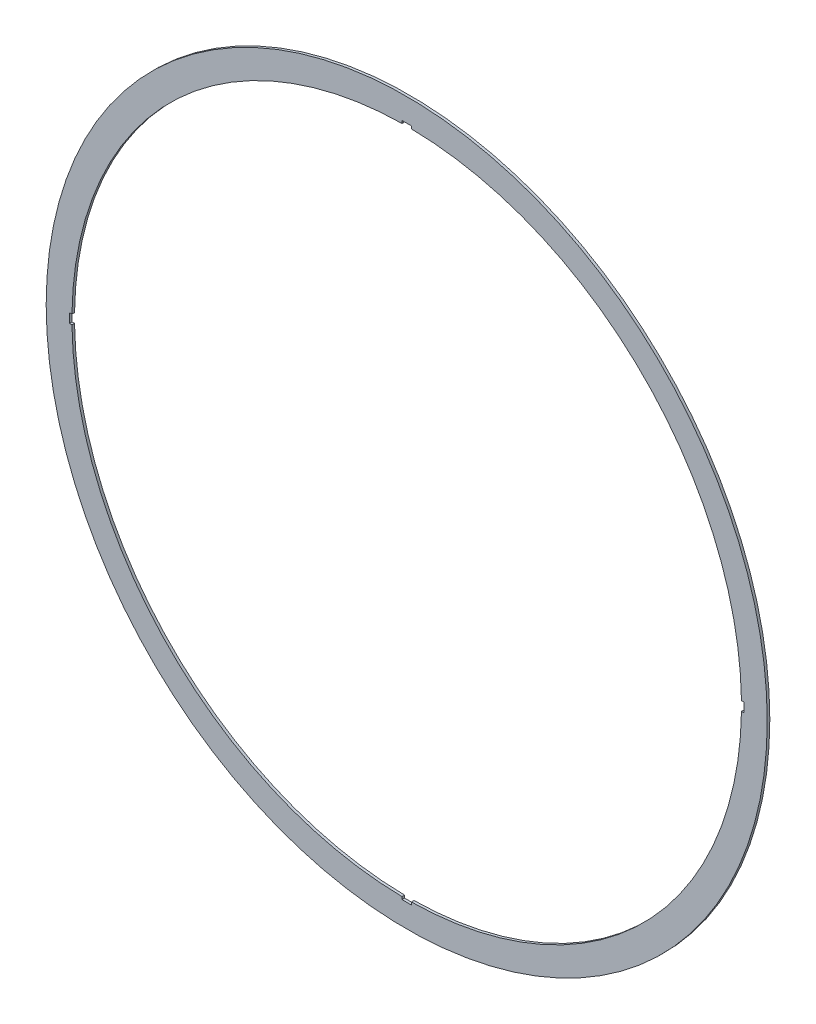
ISO-10303-21;
HEADER;
FILE_DESCRIPTION(('STEP AP214'),'2;1');
FILE_NAME('part.step','',(''),(''),'','','');
FILE_SCHEMA(('AUTOMOTIVE_DESIGN { 1 0 10303 214 1 1 1 1 }'));
ENDSEC;
DATA;
#1=APPLICATION_CONTEXT('core data for automotive mechanical design processes');
#2=APPLICATION_PROTOCOL_DEFINITION('international standard','automotive_design',2000,#1);
#3=PRODUCT_CONTEXT('',#1,'mechanical');
#4=PRODUCT('Part','Part','',(#3));
#5=PRODUCT_RELATED_PRODUCT_CATEGORY('part','',(#4));
#6=PRODUCT_DEFINITION_FORMATION('','',#4);
#7=PRODUCT_DEFINITION_CONTEXT('part definition',#1,'design');
#8=PRODUCT_DEFINITION('design','',#6,#7);
#9=PRODUCT_DEFINITION_SHAPE('','',#8);
#10=(LENGTH_UNIT() NAMED_UNIT(*) SI_UNIT(.MILLI.,.METRE.));
#11=(NAMED_UNIT(*) PLANE_ANGLE_UNIT() SI_UNIT($,.RADIAN.));
#12=(NAMED_UNIT(*) SI_UNIT($,.STERADIAN.) SOLID_ANGLE_UNIT());
#13=UNCERTAINTY_MEASURE_WITH_UNIT(LENGTH_MEASURE(1.E-05),#10,'distance_accuracy_value','');
#14=(GEOMETRIC_REPRESENTATION_CONTEXT(3) GLOBAL_UNCERTAINTY_ASSIGNED_CONTEXT((#13)) GLOBAL_UNIT_ASSIGNED_CONTEXT((#10,
#11,#12)) REPRESENTATION_CONTEXT('',''));
#15=CARTESIAN_POINT('',(0.,0.,0.));
#16=DIRECTION('',(0.,0.,1.));
#17=DIRECTION('',(1.,0.,0.));
#18=AXIS2_PLACEMENT_3D('',#15,#16,#17);
#19=CARTESIAN_POINT('',(0.,0.,3.));
#20=DIRECTION('',(0.,0.,1.));
#21=DIRECTION('',(1.,0.,0.));
#22=AXIS2_PLACEMENT_3D('',#19,#20,#21);
#23=PLANE('',#22);
#24=CARTESIAN_POINT('',(0.,0.,3.));
#25=DIRECTION('',(0.,0.,1.));
#26=DIRECTION('',(1.,0.,0.));
#27=AXIS2_PLACEMENT_3D('',#24,#25,#26);
#28=CIRCLE('',#27,420.);
#29=CARTESIAN_POINT('',(420.,0.,3.));
#30=VERTEX_POINT('',#29);
#31=EDGE_CURVE('E11',#30,#30,#28,.T.);
#32=ORIENTED_EDGE('',*,*,#31,.T.);
#33=EDGE_LOOP('',(#32));
#34=FACE_BOUND('',#33,.T.);
#35=CARTESIAN_POINT('',(0.,0.,3.));
#36=DIRECTION('',(0.,0.,1.));
#37=DIRECTION('',(1.,0.,0.));
#38=AXIS2_PLACEMENT_3D('',#35,#36,#37);
#39=CIRCLE('',#38,390.);
#40=CARTESIAN_POINT('',(-5.44186046511621,389.962031683442,3.));
#41=VERTEX_POINT('',#40);
#42=CARTESIAN_POINT('',(-389.962031683443,5.44186046509927,3.));
#43=VERTEX_POINT('',#42);
#44=EDGE_CURVE('E162',#41,#43,#39,.T.);
#45=ORIENTED_EDGE('',*,*,#44,.F.);
#46=DIRECTION('',(0.,-1.,0.));
#47=VECTOR('',#46,1.);
#48=CARTESIAN_POINT('',(-5.44186046511624,393.003894186332,3.));
#49=LINE('',#48,#47);
#50=CARTESIAN_POINT('',(-5.44186046511624,393.003894186332,3.));
#51=VERTEX_POINT('',#50);
#52=EDGE_CURVE('E153',#51,#41,#49,.T.);
#53=ORIENTED_EDGE('',*,*,#52,.F.);
#54=DIRECTION('',(-1.,0.,0.));
#55=VECTOR('',#54,1.);
#56=CARTESIAN_POINT('',(-5.44186046511624,393.003894186332,3.));
#57=LINE('',#56,#55);
#58=CARTESIAN_POINT('',(5.44186046509934,393.003894186332,3.));
#59=VERTEX_POINT('',#58);
#60=EDGE_CURVE('E217',#59,#51,#57,.T.);
#61=ORIENTED_EDGE('',*,*,#60,.F.);
#62=DIRECTION('',(0.,1.,0.));
#63=VECTOR('',#62,1.);
#64=CARTESIAN_POINT('',(5.44186046509934,393.003894186332,3.));
#65=LINE('',#64,#63);
#66=CARTESIAN_POINT('',(5.44186046509934,389.962031683443,3.));
#67=VERTEX_POINT('',#66);
#68=EDGE_CURVE('E214',#67,#59,#65,.T.);
#69=ORIENTED_EDGE('',*,*,#68,.F.);
#70=CARTESIAN_POINT('',(0.,0.,3.));
#71=DIRECTION('',(0.,0.,1.));
#72=DIRECTION('',(1.,0.,0.));
#73=AXIS2_PLACEMENT_3D('',#70,#71,#72);
#74=CIRCLE('',#73,390.);
#75=CARTESIAN_POINT('',(389.962031683442,5.44186046511627,3.));
#76=VERTEX_POINT('',#75);
#77=EDGE_CURVE('E211',#76,#67,#74,.T.);
#78=ORIENTED_EDGE('',*,*,#77,.F.);
#79=DIRECTION('',(-1.,0.,0.));
#80=VECTOR('',#79,1.);
#81=CARTESIAN_POINT('',(393.003894186332,5.44186046511627,3.));
#82=LINE('',#81,#80);
#83=CARTESIAN_POINT('',(393.003894186332,5.44186046511627,3.));
#84=VERTEX_POINT('',#83);
#85=EDGE_CURVE('E208',#84,#76,#82,.T.);
#86=ORIENTED_EDGE('',*,*,#85,.F.);
#87=DIRECTION('',(0.,1.,0.));
#88=VECTOR('',#87,1.);
#89=CARTESIAN_POINT('',(393.003894186332,5.44186046511627,3.));
#90=LINE('',#89,#88);
#91=CARTESIAN_POINT('',(393.003894186332,-5.44186046509932,3.));
#92=VERTEX_POINT('',#91);
#93=EDGE_CURVE('E205',#92,#84,#90,.T.);
#94=ORIENTED_EDGE('',*,*,#93,.F.);
#95=DIRECTION('',(1.,0.,0.));
#96=VECTOR('',#95,1.);
#97=CARTESIAN_POINT('',(393.003894186332,-5.44186046509932,3.));
#98=LINE('',#97,#96);
#99=CARTESIAN_POINT('',(389.962031683443,-5.44186046509932,3.));
#100=VERTEX_POINT('',#99);
#101=EDGE_CURVE('E202',#100,#92,#98,.T.);
#102=ORIENTED_EDGE('',*,*,#101,.F.);
#103=CARTESIAN_POINT('',(0.,0.,3.));
#104=DIRECTION('',(0.,0.,1.));
#105=DIRECTION('',(1.,0.,0.));
#106=AXIS2_PLACEMENT_3D('',#103,#104,#105);
#107=CIRCLE('',#106,390.);
#108=CARTESIAN_POINT('',(5.44186046511633,-389.962031683442,3.));
#109=VERTEX_POINT('',#108);
#110=EDGE_CURVE('E199',#109,#100,#107,.T.);
#111=ORIENTED_EDGE('',*,*,#110,.F.);
#112=DIRECTION('',(0.,1.,0.));
#113=VECTOR('',#112,1.);
#114=CARTESIAN_POINT('',(5.44186046511629,-393.003894186332,3.));
#115=LINE('',#114,#113);
#116=CARTESIAN_POINT('',(5.44186046511629,-393.003894186332,3.));
#117=VERTEX_POINT('',#116);
#118=EDGE_CURVE('E196',#117,#109,#115,.T.);
#119=ORIENTED_EDGE('',*,*,#118,.F.);
#120=DIRECTION('',(1.,0.,0.));
#121=VECTOR('',#120,1.);
#122=CARTESIAN_POINT('',(5.44186046511629,-393.003894186332,3.));
#123=LINE('',#122,#121);
#124=CARTESIAN_POINT('',(-5.44186046509929,-393.003894186332,3.));
#125=VERTEX_POINT('',#124);
#126=EDGE_CURVE('E193',#125,#117,#123,.T.);
#127=ORIENTED_EDGE('',*,*,#126,.F.);
#128=DIRECTION('',(0.,-1.,0.));
#129=VECTOR('',#128,1.);
#130=CARTESIAN_POINT('',(-5.44186046509929,-393.003894186332,3.));
#131=LINE('',#130,#129);
#132=CARTESIAN_POINT('',(-5.44186046509929,-389.962031683443,3.));
#133=VERTEX_POINT('',#132);
#134=EDGE_CURVE('E190',#133,#125,#131,.T.);
#135=ORIENTED_EDGE('',*,*,#134,.F.);
#136=CARTESIAN_POINT('',(0.,0.,3.));
#137=DIRECTION('',(0.,0.,1.));
#138=DIRECTION('',(1.,0.,0.));
#139=AXIS2_PLACEMENT_3D('',#136,#137,#138);
#140=CIRCLE('',#139,390.);
#141=CARTESIAN_POINT('',(-389.962031683442,-5.44186046511618,3.));
#142=VERTEX_POINT('',#141);
#143=EDGE_CURVE('E187',#142,#133,#140,.T.);
#144=ORIENTED_EDGE('',*,*,#143,.F.);
#145=DIRECTION('',(1.,0.,0.));
#146=VECTOR('',#145,1.);
#147=CARTESIAN_POINT('',(-393.003894186332,-5.44186046511631,3.));
#148=LINE('',#147,#146);
#149=CARTESIAN_POINT('',(-393.003894186332,-5.44186046511631,3.));
#150=VERTEX_POINT('',#149);
#151=EDGE_CURVE('E184',#150,#142,#148,.T.);
#152=ORIENTED_EDGE('',*,*,#151,.F.);
#153=DIRECTION('',(0.,-1.,0.));
#154=VECTOR('',#153,1.);
#155=CARTESIAN_POINT('',(-393.003894186332,-5.44186046511631,3.));
#156=LINE('',#155,#154);
#157=CARTESIAN_POINT('',(-393.003894186332,5.44186046509927,3.));
#158=VERTEX_POINT('',#157);
#159=EDGE_CURVE('E179',#158,#150,#156,.T.);
#160=ORIENTED_EDGE('',*,*,#159,.F.);
#161=DIRECTION('',(-1.,0.,0.));
#162=VECTOR('',#161,1.);
#163=CARTESIAN_POINT('',(-393.003894186332,5.44186046509927,3.));
#164=LINE('',#163,#162);
#165=EDGE_CURVE('E175',#43,#158,#164,.T.);
#166=ORIENTED_EDGE('',*,*,#165,.F.);
#167=EDGE_LOOP('',(#45,#53,#61,#69,#78,#86,#94,#102,#111,#119,#127,#135,#144,#152,#160,#166));
#168=FACE_BOUND('',#167,.T.);
#169=ADVANCED_FACE('F39',(#34,#168),#23,.T.);
#170=CARTESIAN_POINT('',(0.,0.,0.));
#171=DIRECTION('',(0.,0.,1.));
#172=DIRECTION('',(1.,0.,0.));
#173=AXIS2_PLACEMENT_3D('',#170,#171,#172);
#174=PLANE('',#173);
#175=CARTESIAN_POINT('',(0.,0.,0.));
#176=DIRECTION('',(0.,0.,1.));
#177=DIRECTION('',(1.,0.,0.));
#178=AXIS2_PLACEMENT_3D('',#175,#176,#177);
#179=CIRCLE('',#178,420.);
#180=CARTESIAN_POINT('',(420.,0.,0.));
#181=VERTEX_POINT('',#180);
#182=EDGE_CURVE('E43',#181,#181,#179,.T.);
#183=ORIENTED_EDGE('',*,*,#182,.F.);
#184=EDGE_LOOP('',(#183));
#185=FACE_BOUND('',#184,.T.);
#186=DIRECTION('',(0.,-1.,0.));
#187=VECTOR('',#186,1.);
#188=CARTESIAN_POINT('',(-5.44186046511624,393.003894186332,0.));
#189=LINE('',#188,#187);
#190=CARTESIAN_POINT('',(-5.44186046511624,393.003894186332,0.));
#191=VERTEX_POINT('',#190);
#192=CARTESIAN_POINT('',(-5.44186046511621,389.962031683442,0.));
#193=VERTEX_POINT('',#192);
#194=EDGE_CURVE('E63',#191,#193,#189,.T.);
#195=ORIENTED_EDGE('',*,*,#194,.T.);
#196=CARTESIAN_POINT('',(0.,0.,0.));
#197=DIRECTION('',(0.,0.,1.));
#198=DIRECTION('',(1.,0.,0.));
#199=AXIS2_PLACEMENT_3D('',#196,#197,#198);
#200=CIRCLE('',#199,390.);
#201=CARTESIAN_POINT('',(-389.962031683443,5.44186046509927,0.));
#202=VERTEX_POINT('',#201);
#203=EDGE_CURVE('E169',#193,#202,#200,.T.);
#204=ORIENTED_EDGE('',*,*,#203,.T.);
#205=DIRECTION('',(-1.,0.,0.));
#206=VECTOR('',#205,1.);
#207=CARTESIAN_POINT('',(-393.003894186332,5.44186046509927,0.));
#208=LINE('',#207,#206);
#209=CARTESIAN_POINT('',(-393.003894186332,5.44186046509927,0.));
#210=VERTEX_POINT('',#209);
#211=EDGE_CURVE('E224',#202,#210,#208,.T.);
#212=ORIENTED_EDGE('',*,*,#211,.T.);
#213=DIRECTION('',(0.,-1.,0.));
#214=VECTOR('',#213,1.);
#215=CARTESIAN_POINT('',(-393.003894186332,-5.44186046511631,0.));
#216=LINE('',#215,#214);
#217=CARTESIAN_POINT('',(-393.003894186332,-5.44186046511631,0.));
#218=VERTEX_POINT('',#217);
#219=EDGE_CURVE('E228',#210,#218,#216,.T.);
#220=ORIENTED_EDGE('',*,*,#219,.T.);
#221=DIRECTION('',(1.,0.,0.));
#222=VECTOR('',#221,1.);
#223=CARTESIAN_POINT('',(-393.003894186332,-5.44186046511631,0.));
#224=LINE('',#223,#222);
#225=CARTESIAN_POINT('',(-389.962031683442,-5.44186046511618,0.));
#226=VERTEX_POINT('',#225);
#227=EDGE_CURVE('E232',#218,#226,#224,.T.);
#228=ORIENTED_EDGE('',*,*,#227,.T.);
#229=CARTESIAN_POINT('',(0.,0.,0.));
#230=DIRECTION('',(0.,0.,1.));
#231=DIRECTION('',(1.,0.,0.));
#232=AXIS2_PLACEMENT_3D('',#229,#230,#231);
#233=CIRCLE('',#232,390.);
#234=CARTESIAN_POINT('',(-5.44186046509929,-389.962031683443,0.));
#235=VERTEX_POINT('',#234);
#236=EDGE_CURVE('E236',#226,#235,#233,.T.);
#237=ORIENTED_EDGE('',*,*,#236,.T.);
#238=DIRECTION('',(0.,-1.,0.));
#239=VECTOR('',#238,1.);
#240=CARTESIAN_POINT('',(-5.44186046509929,-393.003894186332,0.));
#241=LINE('',#240,#239);
#242=CARTESIAN_POINT('',(-5.44186046509929,-393.003894186332,0.));
#243=VERTEX_POINT('',#242);
#244=EDGE_CURVE('E240',#235,#243,#241,.T.);
#245=ORIENTED_EDGE('',*,*,#244,.T.);
#246=DIRECTION('',(1.,0.,0.));
#247=VECTOR('',#246,1.);
#248=CARTESIAN_POINT('',(5.44186046511629,-393.003894186332,0.));
#249=LINE('',#248,#247);
#250=CARTESIAN_POINT('',(5.44186046511629,-393.003894186332,0.));
#251=VERTEX_POINT('',#250);
#252=EDGE_CURVE('E244',#243,#251,#249,.T.);
#253=ORIENTED_EDGE('',*,*,#252,.T.);
#254=DIRECTION('',(0.,1.,0.));
#255=VECTOR('',#254,1.);
#256=CARTESIAN_POINT('',(5.44186046511629,-393.003894186332,0.));
#257=LINE('',#256,#255);
#258=CARTESIAN_POINT('',(5.44186046511633,-389.962031683442,0.));
#259=VERTEX_POINT('',#258);
#260=EDGE_CURVE('E248',#251,#259,#257,.T.);
#261=ORIENTED_EDGE('',*,*,#260,.T.);
#262=CARTESIAN_POINT('',(0.,0.,0.));
#263=DIRECTION('',(0.,0.,1.));
#264=DIRECTION('',(1.,0.,0.));
#265=AXIS2_PLACEMENT_3D('',#262,#263,#264);
#266=CIRCLE('',#265,390.);
#267=CARTESIAN_POINT('',(389.962031683443,-5.44186046509932,0.));
#268=VERTEX_POINT('',#267);
#269=EDGE_CURVE('E252',#259,#268,#266,.T.);
#270=ORIENTED_EDGE('',*,*,#269,.T.);
#271=DIRECTION('',(1.,0.,0.));
#272=VECTOR('',#271,1.);
#273=CARTESIAN_POINT('',(393.003894186332,-5.44186046509932,0.));
#274=LINE('',#273,#272);
#275=CARTESIAN_POINT('',(393.003894186332,-5.44186046509932,0.));
#276=VERTEX_POINT('',#275);
#277=EDGE_CURVE('E256',#268,#276,#274,.T.);
#278=ORIENTED_EDGE('',*,*,#277,.T.);
#279=DIRECTION('',(0.,1.,0.));
#280=VECTOR('',#279,1.);
#281=CARTESIAN_POINT('',(393.003894186332,5.44186046511627,0.));
#282=LINE('',#281,#280);
#283=CARTESIAN_POINT('',(393.003894186332,5.44186046511627,0.));
#284=VERTEX_POINT('',#283);
#285=EDGE_CURVE('E260',#276,#284,#282,.T.);
#286=ORIENTED_EDGE('',*,*,#285,.T.);
#287=DIRECTION('',(-1.,0.,0.));
#288=VECTOR('',#287,1.);
#289=CARTESIAN_POINT('',(393.003894186332,5.44186046511627,0.));
#290=LINE('',#289,#288);
#291=CARTESIAN_POINT('',(389.962031683442,5.44186046511627,0.));
#292=VERTEX_POINT('',#291);
#293=EDGE_CURVE('E264',#284,#292,#290,.T.);
#294=ORIENTED_EDGE('',*,*,#293,.T.);
#295=CARTESIAN_POINT('',(0.,0.,0.));
#296=DIRECTION('',(0.,0.,1.));
#297=DIRECTION('',(1.,0.,0.));
#298=AXIS2_PLACEMENT_3D('',#295,#296,#297);
#299=CIRCLE('',#298,390.);
#300=CARTESIAN_POINT('',(5.44186046509934,389.962031683443,0.));
#301=VERTEX_POINT('',#300);
#302=EDGE_CURVE('E268',#292,#301,#299,.T.);
#303=ORIENTED_EDGE('',*,*,#302,.T.);
#304=DIRECTION('',(0.,1.,0.));
#305=VECTOR('',#304,1.);
#306=CARTESIAN_POINT('',(5.44186046509934,393.003894186332,0.));
#307=LINE('',#306,#305);
#308=CARTESIAN_POINT('',(5.44186046509934,393.003894186332,0.));
#309=VERTEX_POINT('',#308);
#310=EDGE_CURVE('E272',#301,#309,#307,.T.);
#311=ORIENTED_EDGE('',*,*,#310,.T.);
#312=DIRECTION('',(-1.,0.,0.));
#313=VECTOR('',#312,1.);
#314=CARTESIAN_POINT('',(-5.44186046511624,393.003894186332,0.));
#315=LINE('',#314,#313);
#316=EDGE_CURVE('E163',#309,#191,#315,.T.);
#317=ORIENTED_EDGE('',*,*,#316,.T.);
#318=EDGE_LOOP('',(#195,#204,#212,#220,#228,#237,#245,#253,#261,#270,#278,#286,#294,#303,#311,#317));
#319=FACE_BOUND('',#318,.T.);
#320=ADVANCED_FACE('F326',(#185,#319),#174,.F.);
#321=CARTESIAN_POINT('',(0.,0.,3.));
#322=DIRECTION('',(0.,0.,-1.));
#323=DIRECTION('',(-1.,0.,0.));
#324=AXIS2_PLACEMENT_3D('',#321,#322,#323);
#325=CYLINDRICAL_SURFACE('',#324,420.);
#326=ORIENTED_EDGE('',*,*,#31,.F.);
#327=EDGE_LOOP('',(#326));
#328=FACE_BOUND('',#327,.T.);
#329=ORIENTED_EDGE('',*,*,#182,.T.);
#330=EDGE_LOOP('',(#329));
#331=FACE_BOUND('',#330,.T.);
#332=ADVANCED_FACE('F41',(#328,#331),#325,.T.);
#333=CARTESIAN_POINT('',(-5.44186046511624,393.003894186332,3.));
#334=DIRECTION('',(1.,0.,0.));
#335=DIRECTION('',(0.,0.,-1.));
#336=AXIS2_PLACEMENT_3D('',#333,#334,#335);
#337=PLANE('',#336);
#338=ORIENTED_EDGE('',*,*,#194,.F.);
#339=DIRECTION('',(0.,0.,-1.));
#340=VECTOR('',#339,1.);
#341=CARTESIAN_POINT('',(-5.44186046511624,393.003894186332,3.));
#342=LINE('',#341,#340);
#343=EDGE_CURVE('E157',#51,#191,#342,.T.);
#344=ORIENTED_EDGE('',*,*,#343,.F.);
#345=ORIENTED_EDGE('',*,*,#52,.T.);
#346=DIRECTION('',(0.,0.,-1.));
#347=VECTOR('',#346,1.);
#348=CARTESIAN_POINT('',(-5.44186046511621,389.962031683442,3.));
#349=LINE('',#348,#347);
#350=EDGE_CURVE('E156',#41,#193,#349,.T.);
#351=ORIENTED_EDGE('',*,*,#350,.T.);
#352=EDGE_LOOP('',(#338,#344,#345,#351));
#353=FACE_BOUND('',#352,.T.);
#354=ADVANCED_FACE('F155',(#353),#337,.T.);
#355=CARTESIAN_POINT('',(0.,0.,3.));
#356=DIRECTION('',(0.,0.,-1.));
#357=DIRECTION('',(-1.,0.,0.));
#358=AXIS2_PLACEMENT_3D('',#355,#356,#357);
#359=CYLINDRICAL_SURFACE('',#358,390.);
#360=ORIENTED_EDGE('',*,*,#203,.F.);
#361=ORIENTED_EDGE('',*,*,#350,.F.);
#362=ORIENTED_EDGE('',*,*,#44,.T.);
#363=DIRECTION('',(0.,0.,-1.));
#364=VECTOR('',#363,1.);
#365=CARTESIAN_POINT('',(-389.962031683443,5.44186046509927,3.));
#366=LINE('',#365,#364);
#367=EDGE_CURVE('E171',#43,#202,#366,.T.);
#368=ORIENTED_EDGE('',*,*,#367,.T.);
#369=EDGE_LOOP('',(#360,#361,#362,#368));
#370=FACE_BOUND('',#369,.T.);
#371=ADVANCED_FACE('F166',(#370),#359,.F.);
#372=CARTESIAN_POINT('',(-393.003894186332,5.44186046509927,3.));
#373=DIRECTION('',(0.,-1.,0.));
#374=DIRECTION('',(1.,0.,0.));
#375=AXIS2_PLACEMENT_3D('',#372,#373,#374);
#376=PLANE('',#375);
#377=ORIENTED_EDGE('',*,*,#211,.F.);
#378=ORIENTED_EDGE('',*,*,#367,.F.);
#379=ORIENTED_EDGE('',*,*,#165,.T.);
#380=DIRECTION('',(0.,0.,-1.));
#381=VECTOR('',#380,1.);
#382=CARTESIAN_POINT('',(-393.003894186332,5.44186046509927,3.));
#383=LINE('',#382,#381);
#384=EDGE_CURVE('E316',#158,#210,#383,.T.);
#385=ORIENTED_EDGE('',*,*,#384,.T.);
#386=EDGE_LOOP('',(#377,#378,#379,#385));
#387=FACE_BOUND('',#386,.T.);
#388=ADVANCED_FACE('F322',(#387),#376,.T.);
#389=CARTESIAN_POINT('',(-393.003894186332,-5.44186046511631,3.));
#390=DIRECTION('',(1.,0.,0.));
#391=DIRECTION('',(0.,0.,-1.));
#392=AXIS2_PLACEMENT_3D('',#389,#390,#391);
#393=PLANE('',#392);
#394=ORIENTED_EDGE('',*,*,#219,.F.);
#395=ORIENTED_EDGE('',*,*,#384,.F.);
#396=ORIENTED_EDGE('',*,*,#159,.T.);
#397=DIRECTION('',(0.,0.,-1.));
#398=VECTOR('',#397,1.);
#399=CARTESIAN_POINT('',(-393.003894186332,-5.44186046511631,3.));
#400=LINE('',#399,#398);
#401=EDGE_CURVE('E313',#150,#218,#400,.T.);
#402=ORIENTED_EDGE('',*,*,#401,.T.);
#403=EDGE_LOOP('',(#394,#395,#396,#402));
#404=FACE_BOUND('',#403,.T.);
#405=ADVANCED_FACE('F384',(#404),#393,.T.);
#406=CARTESIAN_POINT('',(-393.003894186332,-5.44186046511631,3.));
#407=DIRECTION('',(0.,1.,0.));
#408=DIRECTION('',(-1.,0.,0.));
#409=AXIS2_PLACEMENT_3D('',#406,#407,#408);
#410=PLANE('',#409);
#411=ORIENTED_EDGE('',*,*,#227,.F.);
#412=ORIENTED_EDGE('',*,*,#401,.F.);
#413=ORIENTED_EDGE('',*,*,#151,.T.);
#414=DIRECTION('',(0.,0.,-1.));
#415=VECTOR('',#414,1.);
#416=CARTESIAN_POINT('',(-389.962031683442,-5.44186046511618,3.));
#417=LINE('',#416,#415);
#418=EDGE_CURVE('E310',#142,#226,#417,.T.);
#419=ORIENTED_EDGE('',*,*,#418,.T.);
#420=EDGE_LOOP('',(#411,#412,#413,#419));
#421=FACE_BOUND('',#420,.T.);
#422=ADVANCED_FACE('F381',(#421),#410,.T.);
#423=CARTESIAN_POINT('',(0.,0.,3.));
#424=DIRECTION('',(0.,0.,-1.));
#425=DIRECTION('',(-1.,0.,0.));
#426=AXIS2_PLACEMENT_3D('',#423,#424,#425);
#427=CYLINDRICAL_SURFACE('',#426,390.);
#428=ORIENTED_EDGE('',*,*,#236,.F.);
#429=ORIENTED_EDGE('',*,*,#418,.F.);
#430=ORIENTED_EDGE('',*,*,#143,.T.);
#431=DIRECTION('',(0.,0.,-1.));
#432=VECTOR('',#431,1.);
#433=CARTESIAN_POINT('',(-5.44186046509929,-389.962031683443,3.));
#434=LINE('',#433,#432);
#435=EDGE_CURVE('E307',#133,#235,#434,.T.);
#436=ORIENTED_EDGE('',*,*,#435,.T.);
#437=EDGE_LOOP('',(#428,#429,#430,#436));
#438=FACE_BOUND('',#437,.T.);
#439=ADVANCED_FACE('F378',(#438),#427,.F.);
#440=CARTESIAN_POINT('',(-5.44186046509929,-393.003894186332,3.));
#441=DIRECTION('',(1.,0.,0.));
#442=DIRECTION('',(0.,1.,0.));
#443=AXIS2_PLACEMENT_3D('',#440,#441,#442);
#444=PLANE('',#443);
#445=ORIENTED_EDGE('',*,*,#244,.F.);
#446=ORIENTED_EDGE('',*,*,#435,.F.);
#447=ORIENTED_EDGE('',*,*,#134,.T.);
#448=DIRECTION('',(0.,0.,-1.));
#449=VECTOR('',#448,1.);
#450=CARTESIAN_POINT('',(-5.44186046509929,-393.003894186332,3.));
#451=LINE('',#450,#449);
#452=EDGE_CURVE('E304',#125,#243,#451,.T.);
#453=ORIENTED_EDGE('',*,*,#452,.T.);
#454=EDGE_LOOP('',(#445,#446,#447,#453));
#455=FACE_BOUND('',#454,.T.);
#456=ADVANCED_FACE('F371',(#455),#444,.T.);
#457=CARTESIAN_POINT('',(5.44186046511629,-393.003894186332,3.));
#458=DIRECTION('',(0.,1.,0.));
#459=DIRECTION('',(0.,0.,1.));
#460=AXIS2_PLACEMENT_3D('',#457,#458,#459);
#461=PLANE('',#460);
#462=ORIENTED_EDGE('',*,*,#252,.F.);
#463=ORIENTED_EDGE('',*,*,#452,.F.);
#464=ORIENTED_EDGE('',*,*,#126,.T.);
#465=DIRECTION('',(0.,0.,-1.));
#466=VECTOR('',#465,1.);
#467=CARTESIAN_POINT('',(5.44186046511629,-393.003894186332,3.));
#468=LINE('',#467,#466);
#469=EDGE_CURVE('E301',#117,#251,#468,.T.);
#470=ORIENTED_EDGE('',*,*,#469,.T.);
#471=EDGE_LOOP('',(#462,#463,#464,#470));
#472=FACE_BOUND('',#471,.T.);
#473=ADVANCED_FACE('F367',(#472),#461,.T.);
#474=CARTESIAN_POINT('',(5.44186046511629,-393.003894186332,3.));
#475=DIRECTION('',(-1.,0.,0.));
#476=DIRECTION('',(0.,-1.,0.));
#477=AXIS2_PLACEMENT_3D('',#474,#475,#476);
#478=PLANE('',#477);
#479=ORIENTED_EDGE('',*,*,#260,.F.);
#480=ORIENTED_EDGE('',*,*,#469,.F.);
#481=ORIENTED_EDGE('',*,*,#118,.T.);
#482=DIRECTION('',(0.,0.,-1.));
#483=VECTOR('',#482,1.);
#484=CARTESIAN_POINT('',(5.44186046511633,-389.962031683442,3.));
#485=LINE('',#484,#483);
#486=EDGE_CURVE('E298',#109,#259,#485,.T.);
#487=ORIENTED_EDGE('',*,*,#486,.T.);
#488=EDGE_LOOP('',(#479,#480,#481,#487));
#489=FACE_BOUND('',#488,.T.);
#490=ADVANCED_FACE('F364',(#489),#478,.T.);
#491=CARTESIAN_POINT('',(0.,0.,3.));
#492=DIRECTION('',(0.,0.,-1.));
#493=DIRECTION('',(-1.,0.,0.));
#494=AXIS2_PLACEMENT_3D('',#491,#492,#493);
#495=CYLINDRICAL_SURFACE('',#494,390.);
#496=ORIENTED_EDGE('',*,*,#269,.F.);
#497=ORIENTED_EDGE('',*,*,#486,.F.);
#498=ORIENTED_EDGE('',*,*,#110,.T.);
#499=DIRECTION('',(0.,0.,-1.));
#500=VECTOR('',#499,1.);
#501=CARTESIAN_POINT('',(389.962031683443,-5.44186046509932,3.));
#502=LINE('',#501,#500);
#503=EDGE_CURVE('E295',#100,#268,#502,.T.);
#504=ORIENTED_EDGE('',*,*,#503,.T.);
#505=EDGE_LOOP('',(#496,#497,#498,#504));
#506=FACE_BOUND('',#505,.T.);
#507=ADVANCED_FACE('F356',(#506),#495,.F.);
#508=CARTESIAN_POINT('',(393.003894186332,-5.44186046509932,3.));
#509=DIRECTION('',(0.,1.,0.));
#510=DIRECTION('',(-1.,0.,0.));
#511=AXIS2_PLACEMENT_3D('',#508,#509,#510);
#512=PLANE('',#511);
#513=ORIENTED_EDGE('',*,*,#277,.F.);
#514=ORIENTED_EDGE('',*,*,#503,.F.);
#515=ORIENTED_EDGE('',*,*,#101,.T.);
#516=DIRECTION('',(0.,0.,-1.));
#517=VECTOR('',#516,1.);
#518=CARTESIAN_POINT('',(393.003894186332,-5.44186046509932,3.));
#519=LINE('',#518,#517);
#520=EDGE_CURVE('E292',#92,#276,#519,.T.);
#521=ORIENTED_EDGE('',*,*,#520,.T.);
#522=EDGE_LOOP('',(#513,#514,#515,#521));
#523=FACE_BOUND('',#522,.T.);
#524=ADVANCED_FACE('F352',(#523),#512,.T.);
#525=CARTESIAN_POINT('',(393.003894186332,5.44186046511627,3.));
#526=DIRECTION('',(-1.,0.,0.));
#527=DIRECTION('',(0.,0.,1.));
#528=AXIS2_PLACEMENT_3D('',#525,#526,#527);
#529=PLANE('',#528);
#530=ORIENTED_EDGE('',*,*,#285,.F.);
#531=ORIENTED_EDGE('',*,*,#520,.F.);
#532=ORIENTED_EDGE('',*,*,#93,.T.);
#533=DIRECTION('',(0.,0.,-1.));
#534=VECTOR('',#533,1.);
#535=CARTESIAN_POINT('',(393.003894186332,5.44186046511627,3.));
#536=LINE('',#535,#534);
#537=EDGE_CURVE('E289',#84,#284,#536,.T.);
#538=ORIENTED_EDGE('',*,*,#537,.T.);
#539=EDGE_LOOP('',(#530,#531,#532,#538));
#540=FACE_BOUND('',#539,.T.);
#541=ADVANCED_FACE('F349',(#540),#529,.T.);
#542=CARTESIAN_POINT('',(393.003894186332,5.44186046511627,3.));
#543=DIRECTION('',(0.,-1.,0.));
#544=DIRECTION('',(0.,0.,-1.));
#545=AXIS2_PLACEMENT_3D('',#542,#543,#544);
#546=PLANE('',#545);
#547=ORIENTED_EDGE('',*,*,#293,.F.);
#548=ORIENTED_EDGE('',*,*,#537,.F.);
#549=ORIENTED_EDGE('',*,*,#85,.T.);
#550=DIRECTION('',(0.,0.,-1.));
#551=VECTOR('',#550,1.);
#552=CARTESIAN_POINT('',(389.962031683442,5.44186046511627,3.));
#553=LINE('',#552,#551);
#554=EDGE_CURVE('E286',#76,#292,#553,.T.);
#555=ORIENTED_EDGE('',*,*,#554,.T.);
#556=EDGE_LOOP('',(#547,#548,#549,#555));
#557=FACE_BOUND('',#556,.T.);
#558=ADVANCED_FACE('F341',(#557),#546,.T.);
#559=CARTESIAN_POINT('',(0.,0.,3.));
#560=DIRECTION('',(0.,0.,-1.));
#561=DIRECTION('',(-1.,0.,0.));
#562=AXIS2_PLACEMENT_3D('',#559,#560,#561);
#563=CYLINDRICAL_SURFACE('',#562,390.);
#564=ORIENTED_EDGE('',*,*,#302,.F.);
#565=ORIENTED_EDGE('',*,*,#554,.F.);
#566=ORIENTED_EDGE('',*,*,#77,.T.);
#567=DIRECTION('',(0.,0.,-1.));
#568=VECTOR('',#567,1.);
#569=CARTESIAN_POINT('',(5.44186046509934,389.962031683443,3.));
#570=LINE('',#569,#568);
#571=EDGE_CURVE('E283',#67,#301,#570,.T.);
#572=ORIENTED_EDGE('',*,*,#571,.T.);
#573=EDGE_LOOP('',(#564,#565,#566,#572));
#574=FACE_BOUND('',#573,.T.);
#575=ADVANCED_FACE('F337',(#574),#563,.F.);
#576=CARTESIAN_POINT('',(5.44186046509934,393.003894186332,3.));
#577=DIRECTION('',(-1.,0.,0.));
#578=DIRECTION('',(0.,-1.,0.));
#579=AXIS2_PLACEMENT_3D('',#576,#577,#578);
#580=PLANE('',#579);
#581=ORIENTED_EDGE('',*,*,#310,.F.);
#582=ORIENTED_EDGE('',*,*,#571,.F.);
#583=ORIENTED_EDGE('',*,*,#68,.T.);
#584=DIRECTION('',(0.,0.,-1.));
#585=VECTOR('',#584,1.);
#586=CARTESIAN_POINT('',(5.44186046509934,393.003894186332,3.));
#587=LINE('',#586,#585);
#588=EDGE_CURVE('E55',#59,#309,#587,.T.);
#589=ORIENTED_EDGE('',*,*,#588,.T.);
#590=EDGE_LOOP('',(#581,#582,#583,#589));
#591=FACE_BOUND('',#590,.T.);
#592=ADVANCED_FACE('F334',(#591),#580,.T.);
#593=CARTESIAN_POINT('',(-5.44186046511624,393.003894186332,3.));
#594=DIRECTION('',(0.,-1.,0.));
#595=DIRECTION('',(0.,0.,-1.));
#596=AXIS2_PLACEMENT_3D('',#593,#594,#595);
#597=PLANE('',#596);
#598=ORIENTED_EDGE('',*,*,#316,.F.);
#599=ORIENTED_EDGE('',*,*,#588,.F.);
#600=ORIENTED_EDGE('',*,*,#60,.T.);
#601=ORIENTED_EDGE('',*,*,#343,.T.);
#602=EDGE_LOOP('',(#598,#599,#600,#601));
#603=FACE_BOUND('',#602,.T.);
#604=ADVANCED_FACE('F328',(#603),#597,.T.);
#605=CLOSED_SHELL('',(#169,#320,#332,#354,#371,#388,#405,#422,#439,#456,#473,#490,#507,#524,
#541,#558,#575,#592,#604));
#606=MANIFOLD_SOLID_BREP('B2',#605);
#607=ADVANCED_BREP_SHAPE_REPRESENTATION('',(#18,#606),#14);
#608=SHAPE_DEFINITION_REPRESENTATION(#9,#607);
ENDSEC;
END-ISO-10303-21;
